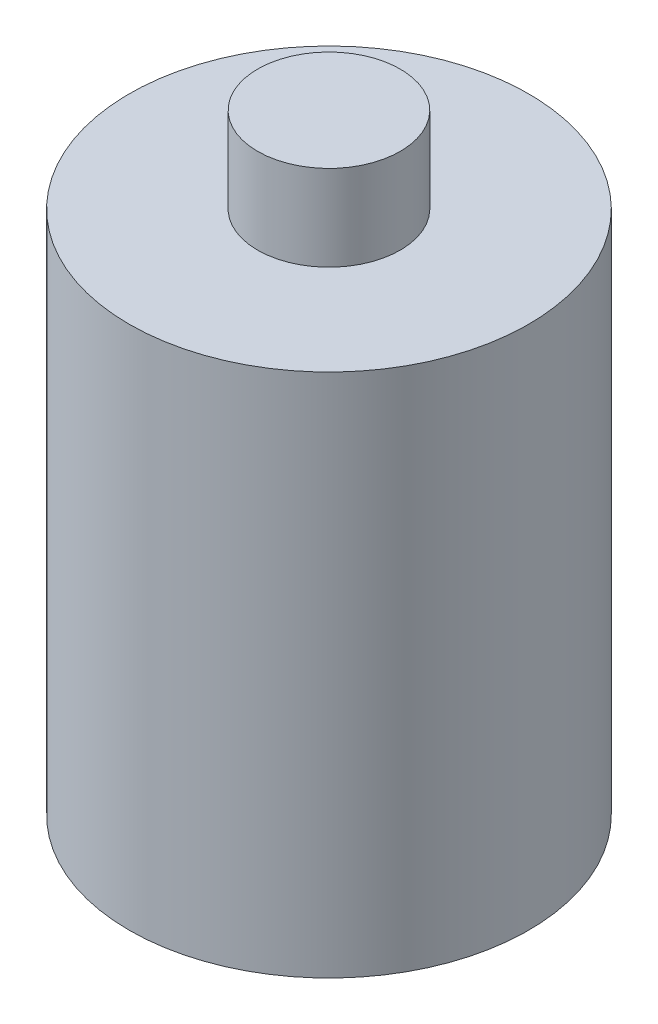
ISO-10303-21;
HEADER;
FILE_DESCRIPTION(('STEP AP214'),'2;1');
FILE_NAME('part.step','',(''),(''),'','','');
FILE_SCHEMA(('AUTOMOTIVE_DESIGN { 1 0 10303 214 1 1 1 1 }'));
ENDSEC;
DATA;
#1=APPLICATION_CONTEXT('core data for automotive mechanical design processes');
#2=APPLICATION_PROTOCOL_DEFINITION('international standard','automotive_design',2000,#1);
#3=PRODUCT_CONTEXT('',#1,'mechanical');
#4=PRODUCT('Part','Part','',(#3));
#5=PRODUCT_RELATED_PRODUCT_CATEGORY('part','',(#4));
#6=PRODUCT_DEFINITION_FORMATION('','',#4);
#7=PRODUCT_DEFINITION_CONTEXT('part definition',#1,'design');
#8=PRODUCT_DEFINITION('design','',#6,#7);
#9=PRODUCT_DEFINITION_SHAPE('','',#8);
#10=(LENGTH_UNIT() NAMED_UNIT(*) SI_UNIT(.MILLI.,.METRE.));
#11=(NAMED_UNIT(*) PLANE_ANGLE_UNIT() SI_UNIT($,.RADIAN.));
#12=(NAMED_UNIT(*) SI_UNIT($,.STERADIAN.) SOLID_ANGLE_UNIT());
#13=UNCERTAINTY_MEASURE_WITH_UNIT(LENGTH_MEASURE(1.E-05),#10,'distance_accuracy_value','');
#14=(GEOMETRIC_REPRESENTATION_CONTEXT(3) GLOBAL_UNCERTAINTY_ASSIGNED_CONTEXT((#13)) GLOBAL_UNIT_ASSIGNED_CONTEXT((#10,
#11,#12)) REPRESENTATION_CONTEXT('',''));
#15=CARTESIAN_POINT('',(0.,0.,0.));
#16=DIRECTION('',(0.,0.,1.));
#17=DIRECTION('',(1.,0.,0.));
#18=AXIS2_PLACEMENT_3D('',#15,#16,#17);
#19=CARTESIAN_POINT('',(0.,18.4,0.));
#20=DIRECTION('',(0.,-1.,0.));
#21=DIRECTION('',(0.,0.,-1.));
#22=AXIS2_PLACEMENT_3D('',#19,#20,#21);
#23=CYLINDRICAL_SURFACE('',#22,7.);
#24=CARTESIAN_POINT('',(0.,18.4,0.));
#25=DIRECTION('',(0.,1.,0.));
#26=DIRECTION('',(0.,0.,1.));
#27=AXIS2_PLACEMENT_3D('',#24,#25,#26);
#28=CIRCLE('',#27,7.);
#29=CARTESIAN_POINT('',(0.,18.4,7.));
#30=VERTEX_POINT('',#29);
#31=EDGE_CURVE('E49',#30,#30,#28,.T.);
#32=ORIENTED_EDGE('',*,*,#31,.F.);
#33=EDGE_LOOP('',(#32));
#34=FACE_BOUND('',#33,.T.);
#35=CARTESIAN_POINT('',(0.,0.,0.));
#36=DIRECTION('',(0.,1.,0.));
#37=DIRECTION('',(0.,0.,1.));
#38=AXIS2_PLACEMENT_3D('',#35,#36,#37);
#39=CIRCLE('',#38,7.);
#40=CARTESIAN_POINT('',(0.,0.,7.));
#41=VERTEX_POINT('',#40);
#42=EDGE_CURVE('E44',#41,#41,#39,.T.);
#43=ORIENTED_EDGE('',*,*,#42,.T.);
#44=EDGE_LOOP('',(#43));
#45=FACE_BOUND('',#44,.T.);
#46=ADVANCED_FACE('F41',(#34,#45),#23,.T.);
#47=CARTESIAN_POINT('',(0.,18.4,0.));
#48=DIRECTION('',(0.,1.,0.));
#49=DIRECTION('',(0.,0.,1.));
#50=AXIS2_PLACEMENT_3D('',#47,#48,#49);
#51=PLANE('',#50);
#52=CARTESIAN_POINT('',(0.,18.4,0.));
#53=DIRECTION('',(0.,1.,0.));
#54=DIRECTION('',(0.,0.,1.));
#55=AXIS2_PLACEMENT_3D('',#52,#53,#54);
#56=CIRCLE('',#55,2.5);
#57=CARTESIAN_POINT('',(0.,18.4,2.5));
#58=VERTEX_POINT('',#57);
#59=EDGE_CURVE('E10',#58,#58,#56,.T.);
#60=ORIENTED_EDGE('',*,*,#59,.F.);
#61=EDGE_LOOP('',(#60));
#62=FACE_BOUND('',#61,.T.);
#63=ORIENTED_EDGE('',*,*,#31,.T.);
#64=EDGE_LOOP('',(#63));
#65=FACE_BOUND('',#64,.T.);
#66=ADVANCED_FACE('F69',(#62,#65),#51,.T.);
#67=CARTESIAN_POINT('',(0.,0.,0.));
#68=DIRECTION('',(0.,1.,0.));
#69=DIRECTION('',(0.,0.,1.));
#70=AXIS2_PLACEMENT_3D('',#67,#68,#69);
#71=PLANE('',#70);
#72=ORIENTED_EDGE('',*,*,#42,.F.);
#73=EDGE_LOOP('',(#72));
#74=FACE_BOUND('',#73,.T.);
#75=ADVANCED_FACE('F66',(#74),#71,.F.);
#76=CARTESIAN_POINT('',(0.,21.4,0.));
#77=DIRECTION('',(0.,-1.,0.));
#78=DIRECTION('',(0.,0.,-1.));
#79=AXIS2_PLACEMENT_3D('',#76,#77,#78);
#80=CYLINDRICAL_SURFACE('',#79,2.5);
#81=CARTESIAN_POINT('',(0.,21.4,0.));
#82=DIRECTION('',(0.,1.,0.));
#83=DIRECTION('',(0.,0.,1.));
#84=AXIS2_PLACEMENT_3D('',#81,#82,#83);
#85=CIRCLE('',#84,2.5);
#86=CARTESIAN_POINT('',(0.,21.4,2.5));
#87=VERTEX_POINT('',#86);
#88=EDGE_CURVE('E56',#87,#87,#85,.T.);
#89=ORIENTED_EDGE('',*,*,#88,.F.);
#90=EDGE_LOOP('',(#89));
#91=FACE_BOUND('',#90,.T.);
#92=ORIENTED_EDGE('',*,*,#59,.T.);
#93=EDGE_LOOP('',(#92));
#94=FACE_BOUND('',#93,.T.);
#95=ADVANCED_FACE('F68',(#91,#94),#80,.T.);
#96=CARTESIAN_POINT('',(0.,21.4,0.));
#97=DIRECTION('',(0.,1.,0.));
#98=DIRECTION('',(0.,0.,1.));
#99=AXIS2_PLACEMENT_3D('',#96,#97,#98);
#100=PLANE('',#99);
#101=ORIENTED_EDGE('',*,*,#88,.T.);
#102=EDGE_LOOP('',(#101));
#103=FACE_BOUND('',#102,.T.);
#104=ADVANCED_FACE('F74',(#103),#100,.T.);
#105=CLOSED_SHELL('',(#46,#66,#75,#95,#104));
#106=MANIFOLD_SOLID_BREP('B2',#105);
#107=ADVANCED_BREP_SHAPE_REPRESENTATION('',(#18,#106),#14);
#108=SHAPE_DEFINITION_REPRESENTATION(#9,#107);
ENDSEC;
END-ISO-10303-21;
